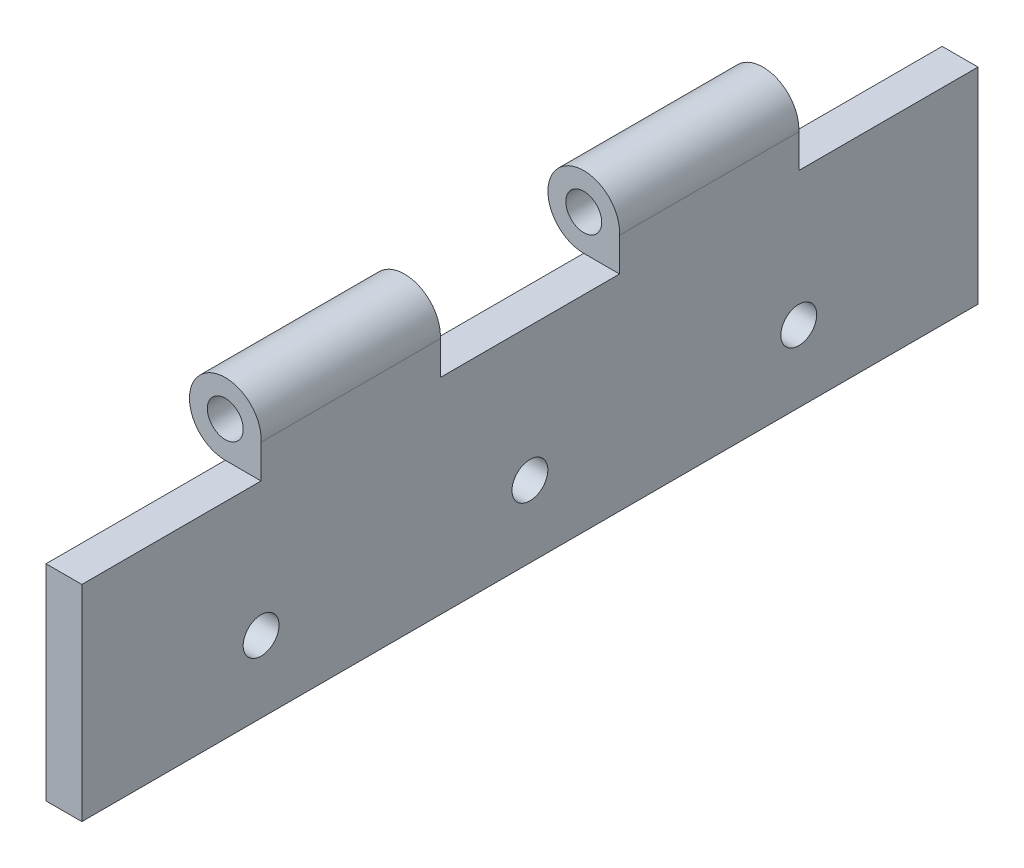
ISO-10303-21;
HEADER;
FILE_DESCRIPTION(('STEP AP214'),'2;1');
FILE_NAME('part.step','',(''),(''),'','','');
FILE_SCHEMA(('AUTOMOTIVE_DESIGN { 1 0 10303 214 1 1 1 1 }'));
ENDSEC;
DATA;
#1=APPLICATION_CONTEXT('core data for automotive mechanical design processes');
#2=APPLICATION_PROTOCOL_DEFINITION('international standard','automotive_design',2000,#1);
#3=PRODUCT_CONTEXT('',#1,'mechanical');
#4=PRODUCT('Part','Part','',(#3));
#5=PRODUCT_RELATED_PRODUCT_CATEGORY('part','',(#4));
#6=PRODUCT_DEFINITION_FORMATION('','',#4);
#7=PRODUCT_DEFINITION_CONTEXT('part definition',#1,'design');
#8=PRODUCT_DEFINITION('design','',#6,#7);
#9=PRODUCT_DEFINITION_SHAPE('','',#8);
#10=(LENGTH_UNIT() NAMED_UNIT(*) SI_UNIT(.MILLI.,.METRE.));
#11=(NAMED_UNIT(*) PLANE_ANGLE_UNIT() SI_UNIT($,.RADIAN.));
#12=(NAMED_UNIT(*) SI_UNIT($,.STERADIAN.) SOLID_ANGLE_UNIT());
#13=UNCERTAINTY_MEASURE_WITH_UNIT(LENGTH_MEASURE(1.E-05),#10,'distance_accuracy_value','');
#14=(GEOMETRIC_REPRESENTATION_CONTEXT(3) GLOBAL_UNCERTAINTY_ASSIGNED_CONTEXT((#13)) GLOBAL_UNIT_ASSIGNED_CONTEXT((#10,
#11,#12)) REPRESENTATION_CONTEXT('',''));
#15=CARTESIAN_POINT('',(0.,0.,0.));
#16=DIRECTION('',(0.,0.,1.));
#17=DIRECTION('',(1.,0.,0.));
#18=AXIS2_PLACEMENT_3D('',#15,#16,#17);
#19=CARTESIAN_POINT('',(1.,-9.42307692307694,-37.5));
#20=DIRECTION('',(1.,0.,0.));
#21=DIRECTION('',(0.,0.,-1.));
#22=AXIS2_PLACEMENT_3D('',#19,#20,#21);
#23=PLANE('',#22);
#24=CARTESIAN_POINT('',(1.,-3.42307692307694,-22.5));
#25=DIRECTION('',(1.,0.,0.));
#26=DIRECTION('',(0.,0.,-1.));
#27=AXIS2_PLACEMENT_3D('',#24,#25,#26);
#28=CIRCLE('',#27,1.5);
#29=CARTESIAN_POINT('',(1.,-3.42307692307694,-24.));
#30=VERTEX_POINT('',#29);
#31=EDGE_CURVE('E207',#30,#30,#28,.F.);
#32=ORIENTED_EDGE('',*,*,#31,.T.);
#33=EDGE_LOOP('',(#32));
#34=FACE_BOUND('',#33,.T.);
#35=CARTESIAN_POINT('',(1.,-3.42307692307694,22.5));
#36=DIRECTION('',(1.,0.,0.));
#37=DIRECTION('',(0.,0.,-1.));
#38=AXIS2_PLACEMENT_3D('',#35,#36,#37);
#39=CIRCLE('',#38,1.5);
#40=CARTESIAN_POINT('',(1.,-3.42307692307694,21.));
#41=VERTEX_POINT('',#40);
#42=EDGE_CURVE('E203',#41,#41,#39,.F.);
#43=ORIENTED_EDGE('',*,*,#42,.T.);
#44=EDGE_LOOP('',(#43));
#45=FACE_BOUND('',#44,.T.);
#46=CARTESIAN_POINT('',(1.,-3.42307692307694,0.));
#47=DIRECTION('',(1.,0.,0.));
#48=DIRECTION('',(0.,0.,-1.));
#49=AXIS2_PLACEMENT_3D('',#46,#47,#48);
#50=CIRCLE('',#49,1.5);
#51=CARTESIAN_POINT('',(1.,-3.42307692307694,-1.5));
#52=VERTEX_POINT('',#51);
#53=EDGE_CURVE('E210',#52,#52,#50,.F.);
#54=ORIENTED_EDGE('',*,*,#53,.T.);
#55=EDGE_LOOP('',(#54));
#56=FACE_BOUND('',#55,.T.);
#57=DIRECTION('',(0.,0.,1.));
#58=VECTOR('',#57,1.);
#59=CARTESIAN_POINT('',(1.,7.76969136231966,-37.5));
#60=LINE('',#59,#58);
#61=CARTESIAN_POINT('',(1.,7.76969136231966,-7.5));
#62=VERTEX_POINT('',#61);
#63=CARTESIAN_POINT('',(1.,7.76969136231966,7.5));
#64=VERTEX_POINT('',#63);
#65=EDGE_CURVE('E213',#62,#64,#60,.T.);
#66=ORIENTED_EDGE('',*,*,#65,.T.);
#67=DIRECTION('',(0.,1.,0.));
#68=VECTOR('',#67,1.);
#69=CARTESIAN_POINT('',(1.,-9.42307692307693,7.50000000000001));
#70=LINE('',#69,#68);
#71=CARTESIAN_POINT('',(1.,10.5769230769231,7.5));
#72=VERTEX_POINT('',#71);
#73=EDGE_CURVE('E181',#64,#72,#70,.T.);
#74=ORIENTED_EDGE('',*,*,#73,.T.);
#75=DIRECTION('',(0.,0.,1.));
#76=VECTOR('',#75,1.);
#77=CARTESIAN_POINT('',(1.,10.5769230769231,-37.5));
#78=LINE('',#77,#76);
#79=CARTESIAN_POINT('',(1.,10.5769230769231,22.5));
#80=VERTEX_POINT('',#79);
#81=EDGE_CURVE('E154',#72,#80,#78,.T.);
#82=ORIENTED_EDGE('',*,*,#81,.T.);
#83=DIRECTION('',(0.,-1.,0.));
#84=VECTOR('',#83,1.);
#85=CARTESIAN_POINT('',(1.,-9.42307692307694,22.5));
#86=LINE('',#85,#84);
#87=CARTESIAN_POINT('',(1.,7.76969136231966,22.5));
#88=VERTEX_POINT('',#87);
#89=EDGE_CURVE('E119',#80,#88,#86,.T.);
#90=ORIENTED_EDGE('',*,*,#89,.T.);
#91=DIRECTION('',(0.,0.,1.));
#92=VECTOR('',#91,1.);
#93=CARTESIAN_POINT('',(1.,7.76969136231966,-37.5));
#94=LINE('',#93,#92);
#95=CARTESIAN_POINT('',(1.,7.76969136231966,37.5));
#96=VERTEX_POINT('',#95);
#97=EDGE_CURVE('E131',#88,#96,#94,.T.);
#98=ORIENTED_EDGE('',*,*,#97,.T.);
#99=DIRECTION('',(0.,1.,0.));
#100=VECTOR('',#99,1.);
#101=CARTESIAN_POINT('',(1.,-9.42307692307694,37.5));
#102=LINE('',#101,#100);
#103=CARTESIAN_POINT('',(1.,-9.42307692307694,37.5));
#104=VERTEX_POINT('',#103);
#105=EDGE_CURVE('E215',#104,#96,#102,.T.);
#106=ORIENTED_EDGE('',*,*,#105,.F.);
#107=DIRECTION('',(0.,0.,1.));
#108=VECTOR('',#107,1.);
#109=CARTESIAN_POINT('',(1.,-9.42307692307694,-37.5));
#110=LINE('',#109,#108);
#111=CARTESIAN_POINT('',(1.,-9.42307692307694,-37.5));
#112=VERTEX_POINT('',#111);
#113=EDGE_CURVE('E41',#112,#104,#110,.T.);
#114=ORIENTED_EDGE('',*,*,#113,.F.);
#115=DIRECTION('',(0.,1.,0.));
#116=VECTOR('',#115,1.);
#117=CARTESIAN_POINT('',(1.,-9.42307692307694,-37.5));
#118=LINE('',#117,#116);
#119=CARTESIAN_POINT('',(1.,7.76969136231966,-37.5));
#120=VERTEX_POINT('',#119);
#121=EDGE_CURVE('E222',#112,#120,#118,.T.);
#122=ORIENTED_EDGE('',*,*,#121,.T.);
#123=DIRECTION('',(0.,0.,1.));
#124=VECTOR('',#123,1.);
#125=CARTESIAN_POINT('',(1.,7.76969136231966,-37.5));
#126=LINE('',#125,#124);
#127=CARTESIAN_POINT('',(1.,7.76969136231966,-22.5));
#128=VERTEX_POINT('',#127);
#129=EDGE_CURVE('E57',#120,#128,#126,.T.);
#130=ORIENTED_EDGE('',*,*,#129,.T.);
#131=DIRECTION('',(0.,1.,0.));
#132=VECTOR('',#131,1.);
#133=CARTESIAN_POINT('',(1.,-9.42307692307694,-22.5));
#134=LINE('',#133,#132);
#135=CARTESIAN_POINT('',(1.,10.5769230769231,-22.5));
#136=VERTEX_POINT('',#135);
#137=EDGE_CURVE('E191',#128,#136,#134,.T.);
#138=ORIENTED_EDGE('',*,*,#137,.T.);
#139=CARTESIAN_POINT('',(1.,10.5769230769231,-7.5));
#140=VERTEX_POINT('',#139);
#141=EDGE_CURVE('E149',#136,#140,#78,.T.);
#142=ORIENTED_EDGE('',*,*,#141,.T.);
#143=DIRECTION('',(0.,-1.,0.));
#144=VECTOR('',#143,1.);
#145=CARTESIAN_POINT('',(1.,-9.42307692307693,-7.5));
#146=LINE('',#145,#144);
#147=EDGE_CURVE('E49',#140,#62,#146,.T.);
#148=ORIENTED_EDGE('',*,*,#147,.T.);
#149=EDGE_LOOP('',(#66,#74,#82,#90,#98,#106,#114,#122,#130,#138,#142,#148));
#150=FACE_BOUND('',#149,.T.);
#151=ADVANCED_FACE('F33',(#34,#45,#56,#150),#23,.T.);
#152=CARTESIAN_POINT('',(-2.,7.76969136231966,-37.5));
#153=DIRECTION('',(-1.,0.,0.));
#154=DIRECTION('',(0.,-1.,0.));
#155=AXIS2_PLACEMENT_3D('',#152,#153,#154);
#156=PLANE('',#155);
#157=CARTESIAN_POINT('',(-2.,-3.42307692307694,-22.5));
#158=DIRECTION('',(-1.,0.,0.));
#159=DIRECTION('',(0.,-1.,0.));
#160=AXIS2_PLACEMENT_3D('',#157,#158,#159);
#161=CIRCLE('',#160,1.5);
#162=CARTESIAN_POINT('',(-2.,-4.92307692307694,-22.5));
#163=VERTEX_POINT('',#162);
#164=EDGE_CURVE('E206',#163,#163,#161,.F.);
#165=ORIENTED_EDGE('',*,*,#164,.T.);
#166=EDGE_LOOP('',(#165));
#167=FACE_BOUND('',#166,.T.);
#168=DIRECTION('',(0.,0.,1.));
#169=VECTOR('',#168,1.);
#170=CARTESIAN_POINT('',(-2.,-9.42307692307694,-37.5));
#171=LINE('',#170,#169);
#172=CARTESIAN_POINT('',(-2.,-9.42307692307694,-37.5));
#173=VERTEX_POINT('',#172);
#174=CARTESIAN_POINT('',(-2.,-9.42307692307694,37.5));
#175=VERTEX_POINT('',#174);
#176=EDGE_CURVE('E157',#173,#175,#171,.T.);
#177=ORIENTED_EDGE('',*,*,#176,.T.);
#178=DIRECTION('',(0.,-1.,0.));
#179=VECTOR('',#178,1.);
#180=CARTESIAN_POINT('',(-2.,7.76969136231966,37.5));
#181=LINE('',#180,#179);
#182=CARTESIAN_POINT('',(-2.,7.76969136231966,37.5));
#183=VERTEX_POINT('',#182);
#184=EDGE_CURVE('E142',#183,#175,#181,.T.);
#185=ORIENTED_EDGE('',*,*,#184,.F.);
#186=DIRECTION('',(0.,0.,-1.));
#187=VECTOR('',#186,1.);
#188=CARTESIAN_POINT('',(-2.,7.76969136231966,-37.5));
#189=LINE('',#188,#187);
#190=CARTESIAN_POINT('',(-2.,7.76969136231966,22.5));
#191=VERTEX_POINT('',#190);
#192=EDGE_CURVE('E129',#183,#191,#189,.T.);
#193=ORIENTED_EDGE('',*,*,#192,.T.);
#194=DIRECTION('',(0.,0.,1.));
#195=VECTOR('',#194,1.);
#196=CARTESIAN_POINT('',(-2.,7.76969136231966,-37.5));
#197=LINE('',#196,#195);
#198=CARTESIAN_POINT('',(-2.,7.76969136231966,7.5));
#199=VERTEX_POINT('',#198);
#200=EDGE_CURVE('E140',#199,#191,#197,.T.);
#201=ORIENTED_EDGE('',*,*,#200,.F.);
#202=CARTESIAN_POINT('',(-2.,7.76969136231966,-7.5));
#203=VERTEX_POINT('',#202);
#204=EDGE_CURVE('E148',#203,#199,#197,.T.);
#205=ORIENTED_EDGE('',*,*,#204,.F.);
#206=CARTESIAN_POINT('',(-2.,7.76969136231966,-22.5));
#207=VERTEX_POINT('',#206);
#208=EDGE_CURVE('E152',#207,#203,#197,.T.);
#209=ORIENTED_EDGE('',*,*,#208,.F.);
#210=CARTESIAN_POINT('',(-2.,7.76969136231966,-37.5));
#211=VERTEX_POINT('',#210);
#212=EDGE_CURVE('E151',#211,#207,#197,.T.);
#213=ORIENTED_EDGE('',*,*,#212,.F.);
#214=DIRECTION('',(0.,-1.,0.));
#215=VECTOR('',#214,1.);
#216=CARTESIAN_POINT('',(-2.,7.76969136231966,-37.5));
#217=LINE('',#216,#215);
#218=EDGE_CURVE('E225',#211,#173,#217,.T.);
#219=ORIENTED_EDGE('',*,*,#218,.T.);
#220=EDGE_LOOP('',(#177,#185,#193,#201,#205,#209,#213,#219));
#221=FACE_BOUND('',#220,.T.);
#222=CARTESIAN_POINT('',(-2.,-3.42307692307694,22.5));
#223=DIRECTION('',(-1.,0.,0.));
#224=DIRECTION('',(0.,-1.,0.));
#225=AXIS2_PLACEMENT_3D('',#222,#223,#224);
#226=CIRCLE('',#225,1.5);
#227=CARTESIAN_POINT('',(-2.,-4.92307692307694,22.5));
#228=VERTEX_POINT('',#227);
#229=EDGE_CURVE('E202',#228,#228,#226,.F.);
#230=ORIENTED_EDGE('',*,*,#229,.T.);
#231=EDGE_LOOP('',(#230));
#232=FACE_BOUND('',#231,.T.);
#233=CARTESIAN_POINT('',(-2.,-3.42307692307694,0.));
#234=DIRECTION('',(-1.,0.,0.));
#235=DIRECTION('',(0.,-1.,0.));
#236=AXIS2_PLACEMENT_3D('',#233,#234,#235);
#237=CIRCLE('',#236,1.5);
#238=CARTESIAN_POINT('',(-2.,-4.92307692307694,0.));
#239=VERTEX_POINT('',#238);
#240=EDGE_CURVE('E36',#239,#239,#237,.F.);
#241=ORIENTED_EDGE('',*,*,#240,.T.);
#242=EDGE_LOOP('',(#241));
#243=FACE_BOUND('',#242,.T.);
#244=ADVANCED_FACE('F137',(#167,#221,#232,#243),#156,.T.);
#245=CARTESIAN_POINT('',(-1.99380073777854,10.7696849571708,-37.5));
#246=DIRECTION('',(0.,0.,1.));
#247=DIRECTION('',(1.,0.,0.));
#248=AXIS2_PLACEMENT_3D('',#245,#246,#247);
#249=CYLINDRICAL_SURFACE('',#248,3.);
#250=ORIENTED_EDGE('',*,*,#81,.F.);
#251=CARTESIAN_POINT('',(-1.99380073777854,10.7696849571708,7.5));
#252=DIRECTION('',(0.,0.,-1.));
#253=DIRECTION('',(0.,1.,0.));
#254=AXIS2_PLACEMENT_3D('',#251,#252,#253);
#255=CIRCLE('',#254,3.);
#256=EDGE_CURVE('E147',#72,#199,#255,.F.);
#257=ORIENTED_EDGE('',*,*,#256,.T.);
#258=ORIENTED_EDGE('',*,*,#200,.T.);
#259=CARTESIAN_POINT('',(-1.99380073777854,10.7696849571708,22.5));
#260=DIRECTION('',(0.,0.,1.));
#261=DIRECTION('',(1.,0.,0.));
#262=AXIS2_PLACEMENT_3D('',#259,#260,#261);
#263=CIRCLE('',#262,3.);
#264=EDGE_CURVE('E113',#191,#80,#263,.F.);
#265=ORIENTED_EDGE('',*,*,#264,.T.);
#266=EDGE_LOOP('',(#250,#257,#258,#265));
#267=FACE_BOUND('',#266,.T.);
#268=ADVANCED_FACE('F146',(#267),#249,.T.);
#269=ORIENTED_EDGE('',*,*,#208,.T.);
#270=CARTESIAN_POINT('',(-1.99380073777854,10.7696849571708,-7.5));
#271=DIRECTION('',(0.,0.,1.));
#272=DIRECTION('',(0.,-1.,0.));
#273=AXIS2_PLACEMENT_3D('',#270,#271,#272);
#274=CIRCLE('',#273,3.);
#275=EDGE_CURVE('E166',#203,#140,#274,.F.);
#276=ORIENTED_EDGE('',*,*,#275,.T.);
#277=ORIENTED_EDGE('',*,*,#141,.F.);
#278=CARTESIAN_POINT('',(-1.99380073777854,10.7696849571708,-22.5));
#279=DIRECTION('',(0.,0.,-1.));
#280=DIRECTION('',(-1.,0.,0.));
#281=AXIS2_PLACEMENT_3D('',#278,#279,#280);
#282=CIRCLE('',#281,3.);
#283=EDGE_CURVE('E167',#136,#207,#282,.F.);
#284=ORIENTED_EDGE('',*,*,#283,.T.);
#285=EDGE_LOOP('',(#269,#276,#277,#284));
#286=FACE_BOUND('',#285,.T.);
#287=ADVANCED_FACE('F164',(#286),#249,.T.);
#288=CARTESIAN_POINT('',(-1.99380073777854,10.7696849571708,-37.5));
#289=DIRECTION('',(0.,0.,1.));
#290=DIRECTION('',(1.,0.,0.));
#291=AXIS2_PLACEMENT_3D('',#288,#289,#290);
#292=PLANE('',#291);
#293=DIRECTION('',(1.,0.,0.));
#294=VECTOR('',#293,1.);
#295=CARTESIAN_POINT('',(-39.5,7.76969136231966,-37.5));
#296=LINE('',#295,#294);
#297=EDGE_CURVE('E143',#211,#120,#296,.T.);
#298=ORIENTED_EDGE('',*,*,#297,.T.);
#299=ORIENTED_EDGE('',*,*,#121,.F.);
#300=DIRECTION('',(1.,0.,0.));
#301=VECTOR('',#300,1.);
#302=CARTESIAN_POINT('',(1.,-9.42307692307694,-37.5));
#303=LINE('',#302,#301);
#304=EDGE_CURVE('E227',#173,#112,#303,.T.);
#305=ORIENTED_EDGE('',*,*,#304,.F.);
#306=ORIENTED_EDGE('',*,*,#218,.F.);
#307=EDGE_LOOP('',(#298,#299,#305,#306));
#308=FACE_BOUND('',#307,.T.);
#309=ADVANCED_FACE('F292',(#308),#292,.F.);
#310=CARTESIAN_POINT('',(-1.99380073777854,10.7696849571708,37.5));
#311=DIRECTION('',(0.,0.,1.));
#312=DIRECTION('',(1.,0.,0.));
#313=AXIS2_PLACEMENT_3D('',#310,#311,#312);
#314=PLANE('',#313);
#315=ORIENTED_EDGE('',*,*,#105,.T.);
#316=DIRECTION('',(-1.,0.,0.));
#317=VECTOR('',#316,1.);
#318=CARTESIAN_POINT('',(-1.99380073777854,7.76969136231966,37.5));
#319=LINE('',#318,#317);
#320=EDGE_CURVE('E11',#96,#183,#319,.T.);
#321=ORIENTED_EDGE('',*,*,#320,.T.);
#322=ORIENTED_EDGE('',*,*,#184,.T.);
#323=DIRECTION('',(1.,0.,0.));
#324=VECTOR('',#323,1.);
#325=CARTESIAN_POINT('',(1.,-9.42307692307694,37.5));
#326=LINE('',#325,#324);
#327=EDGE_CURVE('E219',#175,#104,#326,.T.);
#328=ORIENTED_EDGE('',*,*,#327,.T.);
#329=EDGE_LOOP('',(#315,#321,#322,#328));
#330=FACE_BOUND('',#329,.T.);
#331=ADVANCED_FACE('F238',(#330),#314,.T.);
#332=CARTESIAN_POINT('',(1.,-9.42307692307694,-37.5));
#333=DIRECTION('',(0.,-1.,0.));
#334=DIRECTION('',(0.,0.,-1.));
#335=AXIS2_PLACEMENT_3D('',#332,#333,#334);
#336=PLANE('',#335);
#337=ORIENTED_EDGE('',*,*,#113,.T.);
#338=ORIENTED_EDGE('',*,*,#327,.F.);
#339=ORIENTED_EDGE('',*,*,#176,.F.);
#340=ORIENTED_EDGE('',*,*,#304,.T.);
#341=EDGE_LOOP('',(#337,#338,#339,#340));
#342=FACE_BOUND('',#341,.T.);
#343=ADVANCED_FACE('F232',(#342),#336,.T.);
#344=CARTESIAN_POINT('',(-39.5,22.7696913623197,22.5));
#345=DIRECTION('',(0.,0.,1.));
#346=DIRECTION('',(1.,0.,0.));
#347=AXIS2_PLACEMENT_3D('',#344,#345,#346);
#348=PLANE('',#347);
#349=ORIENTED_EDGE('',*,*,#264,.F.);
#350=DIRECTION('',(1.,0.,0.));
#351=VECTOR('',#350,1.);
#352=CARTESIAN_POINT('',(-39.5,7.76969136231966,22.5));
#353=LINE('',#352,#351);
#354=EDGE_CURVE('E117',#191,#88,#353,.T.);
#355=ORIENTED_EDGE('',*,*,#354,.T.);
#356=ORIENTED_EDGE('',*,*,#89,.F.);
#357=EDGE_LOOP('',(#349,#355,#356));
#358=FACE_BOUND('',#357,.T.);
#359=CARTESIAN_POINT('',(-1.99380073777854,10.7696849571708,22.5));
#360=DIRECTION('',(0.,0.,1.));
#361=DIRECTION('',(1.,0.,0.));
#362=AXIS2_PLACEMENT_3D('',#359,#360,#361);
#363=CIRCLE('',#362,1.5);
#364=CARTESIAN_POINT('',(-0.493800737778544,10.7696849571708,22.5));
#365=VERTEX_POINT('',#364);
#366=EDGE_CURVE('E124',#365,#365,#363,.F.);
#367=ORIENTED_EDGE('',*,*,#366,.T.);
#368=EDGE_LOOP('',(#367));
#369=FACE_BOUND('',#368,.T.);
#370=ADVANCED_FACE('F115',(#358,#369),#348,.T.);
#371=CARTESIAN_POINT('',(-39.5,7.76969136231966,22.5));
#372=DIRECTION('',(0.,1.,0.));
#373=DIRECTION('',(0.,0.,1.));
#374=AXIS2_PLACEMENT_3D('',#371,#372,#373);
#375=PLANE('',#374);
#376=ORIENTED_EDGE('',*,*,#354,.F.);
#377=ORIENTED_EDGE('',*,*,#192,.F.);
#378=ORIENTED_EDGE('',*,*,#320,.F.);
#379=ORIENTED_EDGE('',*,*,#97,.F.);
#380=EDGE_LOOP('',(#376,#377,#378,#379));
#381=FACE_BOUND('',#380,.T.);
#382=ADVANCED_FACE('F128',(#381),#375,.T.);
#383=CARTESIAN_POINT('',(-39.5,22.7696913623197,-22.5));
#384=DIRECTION('',(0.,0.,-1.));
#385=DIRECTION('',(-1.,0.,0.));
#386=AXIS2_PLACEMENT_3D('',#383,#384,#385);
#387=PLANE('',#386);
#388=DIRECTION('',(1.,0.,0.));
#389=VECTOR('',#388,1.);
#390=CARTESIAN_POINT('',(-39.5,7.76969136231966,-22.5));
#391=LINE('',#390,#389);
#392=EDGE_CURVE('E183',#207,#128,#391,.T.);
#393=ORIENTED_EDGE('',*,*,#392,.F.);
#394=ORIENTED_EDGE('',*,*,#283,.F.);
#395=ORIENTED_EDGE('',*,*,#137,.F.);
#396=EDGE_LOOP('',(#393,#394,#395));
#397=FACE_BOUND('',#396,.T.);
#398=CARTESIAN_POINT('',(-1.99380073777854,10.7696849571708,-22.5));
#399=DIRECTION('',(0.,0.,-1.));
#400=DIRECTION('',(-1.,0.,0.));
#401=AXIS2_PLACEMENT_3D('',#398,#399,#400);
#402=CIRCLE('',#401,1.5);
#403=CARTESIAN_POINT('',(-3.49380073777854,10.7696849571708,-22.5));
#404=VERTEX_POINT('',#403);
#405=EDGE_CURVE('E189',#404,#404,#402,.F.);
#406=ORIENTED_EDGE('',*,*,#405,.T.);
#407=EDGE_LOOP('',(#406));
#408=FACE_BOUND('',#407,.T.);
#409=ADVANCED_FACE('F303',(#397,#408),#387,.T.);
#410=CARTESIAN_POINT('',(-39.5,7.76969136231966,-37.5));
#411=DIRECTION('',(0.,1.,0.));
#412=DIRECTION('',(0.,0.,1.));
#413=AXIS2_PLACEMENT_3D('',#410,#411,#412);
#414=PLANE('',#413);
#415=ORIENTED_EDGE('',*,*,#297,.F.);
#416=ORIENTED_EDGE('',*,*,#212,.T.);
#417=ORIENTED_EDGE('',*,*,#392,.T.);
#418=ORIENTED_EDGE('',*,*,#129,.F.);
#419=EDGE_LOOP('',(#415,#416,#417,#418));
#420=FACE_BOUND('',#419,.T.);
#421=ADVANCED_FACE('F299',(#420),#414,.T.);
#422=CARTESIAN_POINT('',(-1.99380073777854,10.7696849571708,-37.5));
#423=DIRECTION('',(0.,0.,1.));
#424=DIRECTION('',(1.,0.,0.));
#425=AXIS2_PLACEMENT_3D('',#422,#423,#424);
#426=CYLINDRICAL_SURFACE('',#425,1.5);
#427=ORIENTED_EDGE('',*,*,#366,.F.);
#428=EDGE_LOOP('',(#427));
#429=FACE_BOUND('',#428,.T.);
#430=CARTESIAN_POINT('',(-1.99380073777854,10.7696849571708,7.5));
#431=DIRECTION('',(0.,0.,-1.));
#432=DIRECTION('',(0.,1.,0.));
#433=AXIS2_PLACEMENT_3D('',#430,#431,#432);
#434=CIRCLE('',#433,1.5);
#435=CARTESIAN_POINT('',(-1.99380073777854,12.2696849571708,7.5));
#436=VERTEX_POINT('',#435);
#437=EDGE_CURVE('E198',#436,#436,#434,.F.);
#438=ORIENTED_EDGE('',*,*,#437,.F.);
#439=EDGE_LOOP('',(#438));
#440=FACE_BOUND('',#439,.T.);
#441=ADVANCED_FACE('F296',(#429,#440),#426,.F.);
#442=CARTESIAN_POINT('',(-39.5,22.7696913623197,7.5));
#443=DIRECTION('',(0.,0.,-1.));
#444=DIRECTION('',(0.,1.,0.));
#445=AXIS2_PLACEMENT_3D('',#442,#443,#444);
#446=PLANE('',#445);
#447=DIRECTION('',(1.,0.,0.));
#448=VECTOR('',#447,1.);
#449=CARTESIAN_POINT('',(-39.5,7.76969136231966,7.5));
#450=LINE('',#449,#448);
#451=EDGE_CURVE('E132',#199,#64,#450,.T.);
#452=ORIENTED_EDGE('',*,*,#451,.F.);
#453=ORIENTED_EDGE('',*,*,#256,.F.);
#454=ORIENTED_EDGE('',*,*,#73,.F.);
#455=EDGE_LOOP('',(#452,#453,#454));
#456=FACE_BOUND('',#455,.T.);
#457=ORIENTED_EDGE('',*,*,#437,.T.);
#458=EDGE_LOOP('',(#457));
#459=FACE_BOUND('',#458,.T.);
#460=ADVANCED_FACE('F178',(#456,#459),#446,.T.);
#461=CARTESIAN_POINT('',(-39.5,22.7696913623197,-7.5));
#462=DIRECTION('',(0.,0.,1.));
#463=DIRECTION('',(0.,-1.,0.));
#464=AXIS2_PLACEMENT_3D('',#461,#462,#463);
#465=PLANE('',#464);
#466=ORIENTED_EDGE('',*,*,#275,.F.);
#467=DIRECTION('',(1.,0.,0.));
#468=VECTOR('',#467,1.);
#469=CARTESIAN_POINT('',(-39.5,7.76969136231966,-7.5));
#470=LINE('',#469,#468);
#471=EDGE_CURVE('E176',#203,#62,#470,.T.);
#472=ORIENTED_EDGE('',*,*,#471,.T.);
#473=ORIENTED_EDGE('',*,*,#147,.F.);
#474=EDGE_LOOP('',(#466,#472,#473));
#475=FACE_BOUND('',#474,.T.);
#476=CARTESIAN_POINT('',(-1.99380073777854,10.7696849571708,-7.5));
#477=DIRECTION('',(0.,0.,1.));
#478=DIRECTION('',(0.,-1.,0.));
#479=AXIS2_PLACEMENT_3D('',#476,#477,#478);
#480=CIRCLE('',#479,1.5);
#481=CARTESIAN_POINT('',(-1.99380073777854,9.26968495717081,-7.5));
#482=VERTEX_POINT('',#481);
#483=EDGE_CURVE('E195',#482,#482,#480,.F.);
#484=ORIENTED_EDGE('',*,*,#483,.T.);
#485=EDGE_LOOP('',(#484));
#486=FACE_BOUND('',#485,.T.);
#487=ADVANCED_FACE('F316',(#475,#486),#465,.T.);
#488=CARTESIAN_POINT('',(-39.5,7.76969136231966,-7.5));
#489=DIRECTION('',(0.,1.,0.));
#490=DIRECTION('',(0.,0.,1.));
#491=AXIS2_PLACEMENT_3D('',#488,#489,#490);
#492=PLANE('',#491);
#493=ORIENTED_EDGE('',*,*,#471,.F.);
#494=ORIENTED_EDGE('',*,*,#204,.T.);
#495=ORIENTED_EDGE('',*,*,#451,.T.);
#496=ORIENTED_EDGE('',*,*,#65,.F.);
#497=EDGE_LOOP('',(#493,#494,#495,#496));
#498=FACE_BOUND('',#497,.T.);
#499=ADVANCED_FACE('F174',(#498),#492,.T.);
#500=CARTESIAN_POINT('',(-39.5,-3.42307692307694,22.5));
#501=DIRECTION('',(1.,0.,0.));
#502=DIRECTION('',(0.,0.,-1.));
#503=AXIS2_PLACEMENT_3D('',#500,#501,#502);
#504=CYLINDRICAL_SURFACE('',#503,1.5);
#505=ORIENTED_EDGE('',*,*,#42,.F.);
#506=EDGE_LOOP('',(#505));
#507=FACE_BOUND('',#506,.T.);
#508=ORIENTED_EDGE('',*,*,#229,.F.);
#509=EDGE_LOOP('',(#508));
#510=FACE_BOUND('',#509,.T.);
#511=ADVANCED_FACE('F256',(#507,#510),#504,.F.);
#512=CARTESIAN_POINT('',(-39.5,-3.42307692307694,-22.5));
#513=DIRECTION('',(1.,0.,0.));
#514=DIRECTION('',(0.,0.,-1.));
#515=AXIS2_PLACEMENT_3D('',#512,#513,#514);
#516=CYLINDRICAL_SURFACE('',#515,1.5);
#517=ORIENTED_EDGE('',*,*,#31,.F.);
#518=EDGE_LOOP('',(#517));
#519=FACE_BOUND('',#518,.T.);
#520=ORIENTED_EDGE('',*,*,#164,.F.);
#521=EDGE_LOOP('',(#520));
#522=FACE_BOUND('',#521,.T.);
#523=ADVANCED_FACE('F253',(#519,#522),#516,.F.);
#524=CARTESIAN_POINT('',(-39.5,-3.42307692307694,0.));
#525=DIRECTION('',(1.,0.,0.));
#526=DIRECTION('',(0.,0.,-1.));
#527=AXIS2_PLACEMENT_3D('',#524,#525,#526);
#528=CYLINDRICAL_SURFACE('',#527,1.5);
#529=ORIENTED_EDGE('',*,*,#53,.F.);
#530=EDGE_LOOP('',(#529));
#531=FACE_BOUND('',#530,.T.);
#532=ORIENTED_EDGE('',*,*,#240,.F.);
#533=EDGE_LOOP('',(#532));
#534=FACE_BOUND('',#533,.T.);
#535=ADVANCED_FACE('F255',(#531,#534),#528,.F.);
#536=ORIENTED_EDGE('',*,*,#405,.F.);
#537=EDGE_LOOP('',(#536));
#538=FACE_BOUND('',#537,.T.);
#539=ORIENTED_EDGE('',*,*,#483,.F.);
#540=EDGE_LOOP('',(#539));
#541=FACE_BOUND('',#540,.T.);
#542=ADVANCED_FACE('F263',(#538,#541),#426,.F.);
#543=CLOSED_SHELL('',(#151,#244,#268,#287,#309,#331,#343,#370,#382,#409,#421,#441,#460,#487,
#499,#511,#523,#535,#542));
#544=MANIFOLD_SOLID_BREP('B2',#543);
#545=ADVANCED_BREP_SHAPE_REPRESENTATION('',(#18,#544),#14);
#546=SHAPE_DEFINITION_REPRESENTATION(#9,#545);
ENDSEC;
END-ISO-10303-21;
